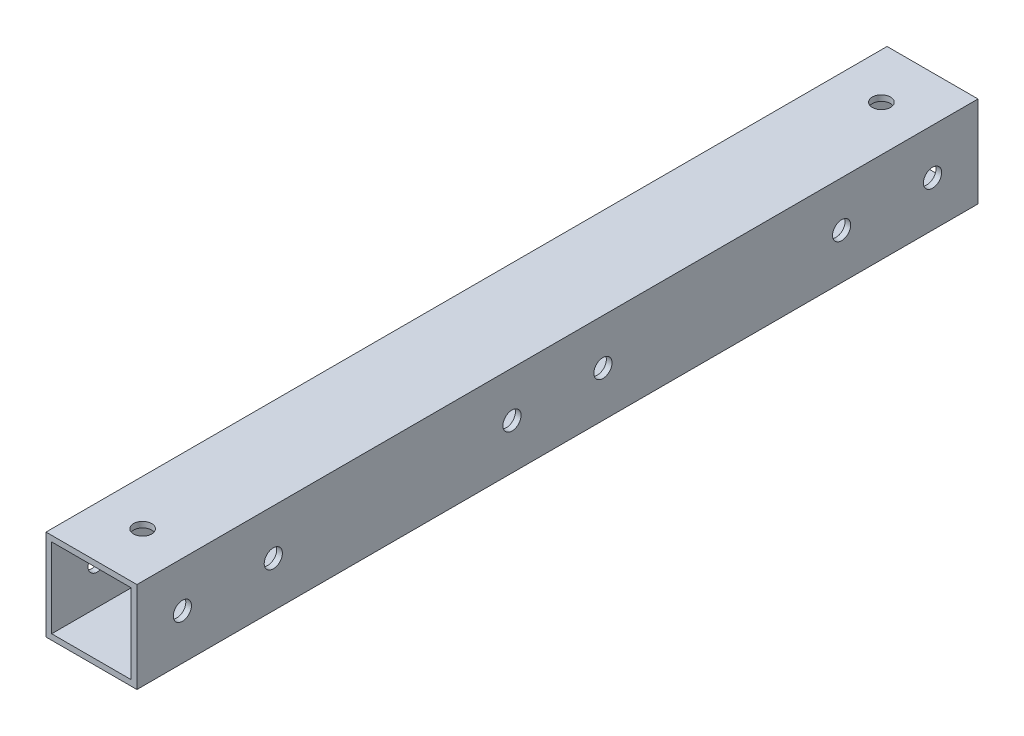
ISO-10303-21;
HEADER;
FILE_DESCRIPTION(('STEP AP214'),'2;1');
FILE_NAME('part.step','',(''),(''),'','','');
FILE_SCHEMA(('AUTOMOTIVE_DESIGN { 1 0 10303 214 1 1 1 1 }'));
ENDSEC;
DATA;
#1=APPLICATION_CONTEXT('core data for automotive mechanical design processes');
#2=APPLICATION_PROTOCOL_DEFINITION('international standard','automotive_design',2000,#1);
#3=PRODUCT_CONTEXT('',#1,'mechanical');
#4=PRODUCT('Part','Part','',(#3));
#5=PRODUCT_RELATED_PRODUCT_CATEGORY('part','',(#4));
#6=PRODUCT_DEFINITION_FORMATION('','',#4);
#7=PRODUCT_DEFINITION_CONTEXT('part definition',#1,'design');
#8=PRODUCT_DEFINITION('design','',#6,#7);
#9=PRODUCT_DEFINITION_SHAPE('','',#8);
#10=(LENGTH_UNIT() NAMED_UNIT(*) SI_UNIT(.MILLI.,.METRE.));
#11=(NAMED_UNIT(*) PLANE_ANGLE_UNIT() SI_UNIT($,.RADIAN.));
#12=(NAMED_UNIT(*) SI_UNIT($,.STERADIAN.) SOLID_ANGLE_UNIT());
#13=UNCERTAINTY_MEASURE_WITH_UNIT(LENGTH_MEASURE(1.E-05),#10,'distance_accuracy_value','');
#14=(GEOMETRIC_REPRESENTATION_CONTEXT(3) GLOBAL_UNCERTAINTY_ASSIGNED_CONTEXT((#13)) GLOBAL_UNIT_ASSIGNED_CONTEXT((#10,
#11,#12)) REPRESENTATION_CONTEXT('',''));
#15=CARTESIAN_POINT('',(0.,0.,0.));
#16=DIRECTION('',(0.,0.,1.));
#17=DIRECTION('',(1.,0.,0.));
#18=AXIS2_PLACEMENT_3D('',#15,#16,#17);
#19=CARTESIAN_POINT('',(0.,0.,234.95));
#20=DIRECTION('',(0.,0.,-1.));
#21=DIRECTION('',(-1.,0.,0.));
#22=AXIS2_PLACEMENT_3D('',#19,#20,#21);
#23=PLANE('',#22);
#24=DIRECTION('',(0.,-1.,0.));
#25=VECTOR('',#24,1.);
#26=CARTESIAN_POINT('',(0.,0.,234.95));
#27=LINE('',#26,#25);
#28=CARTESIAN_POINT('',(0.,25.4,234.95));
#29=VERTEX_POINT('',#28);
#30=CARTESIAN_POINT('',(0.,0.,234.95));
#31=VERTEX_POINT('',#30);
#32=EDGE_CURVE('E157',#29,#31,#27,.T.);
#33=ORIENTED_EDGE('',*,*,#32,.T.);
#34=DIRECTION('',(1.,0.,0.));
#35=VECTOR('',#34,1.);
#36=CARTESIAN_POINT('',(0.,0.,234.95));
#37=LINE('',#36,#35);
#38=CARTESIAN_POINT('',(25.4,0.,234.95));
#39=VERTEX_POINT('',#38);
#40=EDGE_CURVE('E161',#31,#39,#37,.T.);
#41=ORIENTED_EDGE('',*,*,#40,.T.);
#42=DIRECTION('',(0.,1.,0.));
#43=VECTOR('',#42,1.);
#44=CARTESIAN_POINT('',(25.4,0.,234.95));
#45=LINE('',#44,#43);
#46=CARTESIAN_POINT('',(25.4,25.4,234.95));
#47=VERTEX_POINT('',#46);
#48=EDGE_CURVE('E165',#39,#47,#45,.T.);
#49=ORIENTED_EDGE('',*,*,#48,.T.);
#50=DIRECTION('',(-1.,0.,0.));
#51=VECTOR('',#50,1.);
#52=CARTESIAN_POINT('',(0.,25.4,234.95));
#53=LINE('',#52,#51);
#54=EDGE_CURVE('E168',#47,#29,#53,.T.);
#55=ORIENTED_EDGE('',*,*,#54,.T.);
#56=EDGE_LOOP('',(#33,#41,#49,#55));
#57=FACE_BOUND('',#56,.T.);
#58=DIRECTION('',(0.,-1.,0.));
#59=VECTOR('',#58,1.);
#60=CARTESIAN_POINT('',(1.5875,1.5875,234.95));
#61=LINE('',#60,#59);
#62=CARTESIAN_POINT('',(1.5875,23.8125,234.95));
#63=VERTEX_POINT('',#62);
#64=CARTESIAN_POINT('',(1.5875,1.5875,234.95));
#65=VERTEX_POINT('',#64);
#66=EDGE_CURVE('E107',#63,#65,#61,.T.);
#67=ORIENTED_EDGE('',*,*,#66,.F.);
#68=DIRECTION('',(-1.,0.,0.));
#69=VECTOR('',#68,1.);
#70=CARTESIAN_POINT('',(1.5875,23.8125,234.95));
#71=LINE('',#70,#69);
#72=CARTESIAN_POINT('',(23.8125,23.8125,234.95));
#73=VERTEX_POINT('',#72);
#74=EDGE_CURVE('E133',#73,#63,#71,.T.);
#75=ORIENTED_EDGE('',*,*,#74,.F.);
#76=DIRECTION('',(0.,1.,0.));
#77=VECTOR('',#76,1.);
#78=CARTESIAN_POINT('',(23.8125,1.5875,234.95));
#79=LINE('',#78,#77);
#80=CARTESIAN_POINT('',(23.8125,1.5875,234.95));
#81=VERTEX_POINT('',#80);
#82=EDGE_CURVE('E129',#81,#73,#79,.T.);
#83=ORIENTED_EDGE('',*,*,#82,.F.);
#84=DIRECTION('',(1.,0.,0.));
#85=VECTOR('',#84,1.);
#86=CARTESIAN_POINT('',(1.5875,1.5875,234.95));
#87=LINE('',#86,#85);
#88=EDGE_CURVE('E116',#65,#81,#87,.T.);
#89=ORIENTED_EDGE('',*,*,#88,.F.);
#90=EDGE_LOOP('',(#67,#75,#83,#89));
#91=FACE_BOUND('',#90,.T.);
#92=ADVANCED_FACE('F39',(#57,#91),#23,.F.);
#93=CARTESIAN_POINT('',(0.,0.,0.));
#94=DIRECTION('',(0.,0.,-1.));
#95=DIRECTION('',(-1.,0.,0.));
#96=AXIS2_PLACEMENT_3D('',#93,#94,#95);
#97=PLANE('',#96);
#98=DIRECTION('',(0.,-1.,0.));
#99=VECTOR('',#98,1.);
#100=CARTESIAN_POINT('',(0.,0.,0.));
#101=LINE('',#100,#99);
#102=CARTESIAN_POINT('',(0.,25.4,0.));
#103=VERTEX_POINT('',#102);
#104=CARTESIAN_POINT('',(0.,0.,0.));
#105=VERTEX_POINT('',#104);
#106=EDGE_CURVE('E125',#103,#105,#101,.T.);
#107=ORIENTED_EDGE('',*,*,#106,.F.);
#108=DIRECTION('',(-1.,0.,0.));
#109=VECTOR('',#108,1.);
#110=CARTESIAN_POINT('',(0.,25.4,0.));
#111=LINE('',#110,#109);
#112=CARTESIAN_POINT('',(25.4,25.4,0.));
#113=VERTEX_POINT('',#112);
#114=EDGE_CURVE('E162',#113,#103,#111,.T.);
#115=ORIENTED_EDGE('',*,*,#114,.F.);
#116=DIRECTION('',(0.,1.,0.));
#117=VECTOR('',#116,1.);
#118=CARTESIAN_POINT('',(25.4,0.,0.));
#119=LINE('',#118,#117);
#120=CARTESIAN_POINT('',(25.4,0.,0.));
#121=VERTEX_POINT('',#120);
#122=EDGE_CURVE('E178',#121,#113,#119,.T.);
#123=ORIENTED_EDGE('',*,*,#122,.F.);
#124=DIRECTION('',(1.,0.,0.));
#125=VECTOR('',#124,1.);
#126=CARTESIAN_POINT('',(0.,0.,0.));
#127=LINE('',#126,#125);
#128=EDGE_CURVE('E175',#105,#121,#127,.T.);
#129=ORIENTED_EDGE('',*,*,#128,.F.);
#130=EDGE_LOOP('',(#107,#115,#123,#129));
#131=FACE_BOUND('',#130,.T.);
#132=DIRECTION('',(-1.,0.,0.));
#133=VECTOR('',#132,1.);
#134=CARTESIAN_POINT('',(1.5875,23.8125,0.));
#135=LINE('',#134,#133);
#136=CARTESIAN_POINT('',(23.8125,23.8125,0.));
#137=VERTEX_POINT('',#136);
#138=CARTESIAN_POINT('',(1.5875,23.8125,0.));
#139=VERTEX_POINT('',#138);
#140=EDGE_CURVE('E117',#137,#139,#135,.T.);
#141=ORIENTED_EDGE('',*,*,#140,.T.);
#142=DIRECTION('',(0.,-1.,0.));
#143=VECTOR('',#142,1.);
#144=CARTESIAN_POINT('',(1.5875,1.5875,0.));
#145=LINE('',#144,#143);
#146=CARTESIAN_POINT('',(1.5875,1.5875,0.));
#147=VERTEX_POINT('',#146);
#148=EDGE_CURVE('E65',#139,#147,#145,.T.);
#149=ORIENTED_EDGE('',*,*,#148,.T.);
#150=DIRECTION('',(1.,0.,0.));
#151=VECTOR('',#150,1.);
#152=CARTESIAN_POINT('',(1.5875,1.5875,0.));
#153=LINE('',#152,#151);
#154=CARTESIAN_POINT('',(23.8125,1.5875,0.));
#155=VERTEX_POINT('',#154);
#156=EDGE_CURVE('E123',#147,#155,#153,.T.);
#157=ORIENTED_EDGE('',*,*,#156,.T.);
#158=DIRECTION('',(0.,1.,0.));
#159=VECTOR('',#158,1.);
#160=CARTESIAN_POINT('',(23.8125,1.5875,0.));
#161=LINE('',#160,#159);
#162=EDGE_CURVE('E144',#155,#137,#161,.T.);
#163=ORIENTED_EDGE('',*,*,#162,.T.);
#164=EDGE_LOOP('',(#141,#149,#157,#163));
#165=FACE_BOUND('',#164,.T.);
#166=ADVANCED_FACE('F256',(#131,#165),#97,.T.);
#167=CARTESIAN_POINT('',(0.,0.,234.95));
#168=DIRECTION('',(1.,0.,0.));
#169=DIRECTION('',(0.,0.,-1.));
#170=AXIS2_PLACEMENT_3D('',#167,#168,#169);
#171=PLANE('',#170);
#172=CARTESIAN_POINT('',(0.,12.7,222.25));
#173=DIRECTION('',(1.,0.,0.));
#174=DIRECTION('',(0.,0.,-1.));
#175=AXIS2_PLACEMENT_3D('',#172,#173,#174);
#176=CIRCLE('',#175,2.53999999999998);
#177=CARTESIAN_POINT('',(0.,12.7,219.71));
#178=VERTEX_POINT('',#177);
#179=EDGE_CURVE('E198',#178,#178,#176,.T.);
#180=ORIENTED_EDGE('',*,*,#179,.T.);
#181=EDGE_LOOP('',(#180));
#182=FACE_BOUND('',#181,.T.);
#183=CARTESIAN_POINT('',(0.,12.7,38.1));
#184=DIRECTION('',(1.,0.,0.));
#185=DIRECTION('',(0.,0.,1.));
#186=AXIS2_PLACEMENT_3D('',#183,#184,#185);
#187=CIRCLE('',#186,2.53999999999998);
#188=CARTESIAN_POINT('',(0.,12.7,40.6399999999999));
#189=VERTEX_POINT('',#188);
#190=EDGE_CURVE('E316',#189,#189,#187,.T.);
#191=ORIENTED_EDGE('',*,*,#190,.T.);
#192=EDGE_LOOP('',(#191));
#193=FACE_BOUND('',#192,.T.);
#194=CARTESIAN_POINT('',(0.,12.7,130.175));
#195=DIRECTION('',(1.,0.,0.));
#196=DIRECTION('',(0.,0.,1.));
#197=AXIS2_PLACEMENT_3D('',#194,#195,#196);
#198=CIRCLE('',#197,2.54000000000001);
#199=CARTESIAN_POINT('',(0.,12.7,132.715));
#200=VERTEX_POINT('',#199);
#201=EDGE_CURVE('E320',#200,#200,#198,.T.);
#202=ORIENTED_EDGE('',*,*,#201,.T.);
#203=EDGE_LOOP('',(#202));
#204=FACE_BOUND('',#203,.T.);
#205=CARTESIAN_POINT('',(0.,12.7,104.775));
#206=DIRECTION('',(1.,0.,0.));
#207=DIRECTION('',(0.,0.,-1.));
#208=AXIS2_PLACEMENT_3D('',#205,#206,#207);
#209=CIRCLE('',#208,2.54);
#210=CARTESIAN_POINT('',(0.,12.7,102.235));
#211=VERTEX_POINT('',#210);
#212=EDGE_CURVE('E324',#211,#211,#209,.T.);
#213=ORIENTED_EDGE('',*,*,#212,.T.);
#214=EDGE_LOOP('',(#213));
#215=FACE_BOUND('',#214,.T.);
#216=CARTESIAN_POINT('',(0.,12.7,196.85));
#217=DIRECTION('',(1.,0.,0.));
#218=DIRECTION('',(0.,0.,-1.));
#219=AXIS2_PLACEMENT_3D('',#216,#217,#218);
#220=CIRCLE('',#219,2.53999999999998);
#221=CARTESIAN_POINT('',(0.,12.7,194.31));
#222=VERTEX_POINT('',#221);
#223=EDGE_CURVE('E328',#222,#222,#220,.T.);
#224=ORIENTED_EDGE('',*,*,#223,.T.);
#225=EDGE_LOOP('',(#224));
#226=FACE_BOUND('',#225,.T.);
#227=CARTESIAN_POINT('',(0.,12.7,12.7));
#228=DIRECTION('',(1.,0.,0.));
#229=DIRECTION('',(0.,0.,1.));
#230=AXIS2_PLACEMENT_3D('',#227,#228,#229);
#231=CIRCLE('',#230,2.53999999999998);
#232=CARTESIAN_POINT('',(0.,12.7,15.24));
#233=VERTEX_POINT('',#232);
#234=EDGE_CURVE('E331',#233,#233,#231,.T.);
#235=ORIENTED_EDGE('',*,*,#234,.T.);
#236=EDGE_LOOP('',(#235));
#237=FACE_BOUND('',#236,.T.);
#238=ORIENTED_EDGE('',*,*,#106,.T.);
#239=DIRECTION('',(0.,0.,-1.));
#240=VECTOR('',#239,1.);
#241=CARTESIAN_POINT('',(0.,0.,234.95));
#242=LINE('',#241,#240);
#243=EDGE_CURVE('E11',#31,#105,#242,.T.);
#244=ORIENTED_EDGE('',*,*,#243,.F.);
#245=ORIENTED_EDGE('',*,*,#32,.F.);
#246=DIRECTION('',(0.,0.,-1.));
#247=VECTOR('',#246,1.);
#248=CARTESIAN_POINT('',(0.,25.4,234.95));
#249=LINE('',#248,#247);
#250=EDGE_CURVE('E171',#29,#103,#249,.T.);
#251=ORIENTED_EDGE('',*,*,#250,.T.);
#252=EDGE_LOOP('',(#238,#244,#245,#251));
#253=FACE_BOUND('',#252,.T.);
#254=ADVANCED_FACE('F41',(#182,#193,#204,#215,#226,#237,#253),#171,.F.);
#255=CARTESIAN_POINT('',(0.,0.,234.95));
#256=DIRECTION('',(0.,1.,0.));
#257=DIRECTION('',(0.,0.,1.));
#258=AXIS2_PLACEMENT_3D('',#255,#256,#257);
#259=PLANE('',#258);
#260=ORIENTED_EDGE('',*,*,#128,.T.);
#261=DIRECTION('',(0.,0.,-1.));
#262=VECTOR('',#261,1.);
#263=CARTESIAN_POINT('',(25.4,0.,234.95));
#264=LINE('',#263,#262);
#265=EDGE_CURVE('E49',#39,#121,#264,.T.);
#266=ORIENTED_EDGE('',*,*,#265,.F.);
#267=ORIENTED_EDGE('',*,*,#40,.F.);
#268=ORIENTED_EDGE('',*,*,#243,.T.);
#269=EDGE_LOOP('',(#260,#266,#267,#268));
#270=FACE_BOUND('',#269,.T.);
#271=ADVANCED_FACE('F287',(#270),#259,.F.);
#272=CARTESIAN_POINT('',(25.4,0.,234.95));
#273=DIRECTION('',(-1.,0.,0.));
#274=DIRECTION('',(0.,0.,1.));
#275=AXIS2_PLACEMENT_3D('',#272,#273,#274);
#276=PLANE('',#275);
#277=CARTESIAN_POINT('',(25.4,12.7,222.25));
#278=DIRECTION('',(1.,0.,0.));
#279=DIRECTION('',(0.,0.,-1.));
#280=AXIS2_PLACEMENT_3D('',#277,#278,#279);
#281=CIRCLE('',#280,2.53999999999998);
#282=CARTESIAN_POINT('',(25.4,12.7,219.71));
#283=VERTEX_POINT('',#282);
#284=EDGE_CURVE('E416',#283,#283,#281,.T.);
#285=ORIENTED_EDGE('',*,*,#284,.F.);
#286=EDGE_LOOP('',(#285));
#287=FACE_BOUND('',#286,.T.);
#288=CARTESIAN_POINT('',(25.4,12.7,38.1));
#289=DIRECTION('',(1.,0.,0.));
#290=DIRECTION('',(0.,0.,1.));
#291=AXIS2_PLACEMENT_3D('',#288,#289,#290);
#292=CIRCLE('',#291,2.53999999999998);
#293=CARTESIAN_POINT('',(25.4,12.7,40.6399999999999));
#294=VERTEX_POINT('',#293);
#295=EDGE_CURVE('E334',#294,#294,#292,.T.);
#296=ORIENTED_EDGE('',*,*,#295,.F.);
#297=EDGE_LOOP('',(#296));
#298=FACE_BOUND('',#297,.T.);
#299=CARTESIAN_POINT('',(25.4,12.7,130.175));
#300=DIRECTION('',(1.,0.,0.));
#301=DIRECTION('',(0.,0.,1.));
#302=AXIS2_PLACEMENT_3D('',#299,#300,#301);
#303=CIRCLE('',#302,2.54000000000001);
#304=CARTESIAN_POINT('',(25.4,12.7,132.715));
#305=VERTEX_POINT('',#304);
#306=EDGE_CURVE('E422',#305,#305,#303,.T.);
#307=ORIENTED_EDGE('',*,*,#306,.F.);
#308=EDGE_LOOP('',(#307));
#309=FACE_BOUND('',#308,.T.);
#310=CARTESIAN_POINT('',(25.4,12.7,104.775));
#311=DIRECTION('',(1.,0.,0.));
#312=DIRECTION('',(0.,0.,-1.));
#313=AXIS2_PLACEMENT_3D('',#310,#311,#312);
#314=CIRCLE('',#313,2.54);
#315=CARTESIAN_POINT('',(25.4,12.7,102.235));
#316=VERTEX_POINT('',#315);
#317=EDGE_CURVE('E345',#316,#316,#314,.T.);
#318=ORIENTED_EDGE('',*,*,#317,.F.);
#319=EDGE_LOOP('',(#318));
#320=FACE_BOUND('',#319,.T.);
#321=CARTESIAN_POINT('',(25.4,12.7,196.85));
#322=DIRECTION('',(1.,0.,0.));
#323=DIRECTION('',(0.,0.,-1.));
#324=AXIS2_PLACEMENT_3D('',#321,#322,#323);
#325=CIRCLE('',#324,2.53999999999998);
#326=CARTESIAN_POINT('',(25.4,12.7,194.31));
#327=VERTEX_POINT('',#326);
#328=EDGE_CURVE('E430',#327,#327,#325,.T.);
#329=ORIENTED_EDGE('',*,*,#328,.F.);
#330=EDGE_LOOP('',(#329));
#331=FACE_BOUND('',#330,.T.);
#332=CARTESIAN_POINT('',(25.4,12.7,12.7));
#333=DIRECTION('',(1.,0.,0.));
#334=DIRECTION('',(0.,0.,1.));
#335=AXIS2_PLACEMENT_3D('',#332,#333,#334);
#336=CIRCLE('',#335,2.53999999999998);
#337=CARTESIAN_POINT('',(25.4,12.7,15.24));
#338=VERTEX_POINT('',#337);
#339=EDGE_CURVE('E335',#338,#338,#336,.T.);
#340=ORIENTED_EDGE('',*,*,#339,.F.);
#341=EDGE_LOOP('',(#340));
#342=FACE_BOUND('',#341,.T.);
#343=ORIENTED_EDGE('',*,*,#122,.T.);
#344=DIRECTION('',(0.,0.,-1.));
#345=VECTOR('',#344,1.);
#346=CARTESIAN_POINT('',(25.4,25.4,234.95));
#347=LINE('',#346,#345);
#348=EDGE_CURVE('E186',#47,#113,#347,.T.);
#349=ORIENTED_EDGE('',*,*,#348,.F.);
#350=ORIENTED_EDGE('',*,*,#48,.F.);
#351=ORIENTED_EDGE('',*,*,#265,.T.);
#352=EDGE_LOOP('',(#343,#349,#350,#351));
#353=FACE_BOUND('',#352,.T.);
#354=ADVANCED_FACE('F284',(#287,#298,#309,#320,#331,#342,#353),#276,.F.);
#355=CARTESIAN_POINT('',(0.,25.4,234.95));
#356=DIRECTION('',(0.,-1.,0.));
#357=DIRECTION('',(0.,0.,-1.));
#358=AXIS2_PLACEMENT_3D('',#355,#356,#357);
#359=PLANE('',#358);
#360=CARTESIAN_POINT('',(12.7,25.4,220.6625));
#361=DIRECTION('',(0.,1.,0.));
#362=DIRECTION('',(0.,0.,1.));
#363=AXIS2_PLACEMENT_3D('',#360,#361,#362);
#364=CIRCLE('',#363,2.54000000000001);
#365=CARTESIAN_POINT('',(12.7,25.4,223.2025));
#366=VERTEX_POINT('',#365);
#367=EDGE_CURVE('E342',#366,#366,#364,.T.);
#368=ORIENTED_EDGE('',*,*,#367,.F.);
#369=EDGE_LOOP('',(#368));
#370=FACE_BOUND('',#369,.T.);
#371=CARTESIAN_POINT('',(12.7,25.4,14.2875));
#372=DIRECTION('',(0.,1.,0.));
#373=DIRECTION('',(0.,0.,-1.));
#374=AXIS2_PLACEMENT_3D('',#371,#372,#373);
#375=CIRCLE('',#374,2.54);
#376=CARTESIAN_POINT('',(12.7,25.4,16.8275));
#377=VERTEX_POINT('',#376);
#378=EDGE_CURVE('E404',#377,#377,#375,.T.);
#379=ORIENTED_EDGE('',*,*,#378,.F.);
#380=EDGE_LOOP('',(#379));
#381=FACE_BOUND('',#380,.T.);
#382=ORIENTED_EDGE('',*,*,#114,.T.);
#383=ORIENTED_EDGE('',*,*,#250,.F.);
#384=ORIENTED_EDGE('',*,*,#54,.F.);
#385=ORIENTED_EDGE('',*,*,#348,.T.);
#386=EDGE_LOOP('',(#382,#383,#384,#385));
#387=FACE_BOUND('',#386,.T.);
#388=ADVANCED_FACE('F281',(#370,#381,#387),#359,.F.);
#389=CARTESIAN_POINT('',(1.5875,1.5875,234.95));
#390=DIRECTION('',(1.,0.,0.));
#391=DIRECTION('',(0.,0.,-1.));
#392=AXIS2_PLACEMENT_3D('',#389,#390,#391);
#393=PLANE('',#392);
#394=CARTESIAN_POINT('',(1.5875,12.7,222.25));
#395=DIRECTION('',(1.,0.,0.));
#396=DIRECTION('',(0.,0.,-1.));
#397=AXIS2_PLACEMENT_3D('',#394,#395,#396);
#398=CIRCLE('',#397,2.53999999999998);
#399=CARTESIAN_POINT('',(1.5875,12.7,219.71));
#400=VERTEX_POINT('',#399);
#401=EDGE_CURVE('E141',#400,#400,#398,.T.);
#402=ORIENTED_EDGE('',*,*,#401,.F.);
#403=EDGE_LOOP('',(#402));
#404=FACE_BOUND('',#403,.T.);
#405=CARTESIAN_POINT('',(1.5875,12.7,38.1));
#406=DIRECTION('',(1.,0.,0.));
#407=DIRECTION('',(0.,0.,-1.));
#408=AXIS2_PLACEMENT_3D('',#405,#406,#407);
#409=CIRCLE('',#408,2.53999999999998);
#410=CARTESIAN_POINT('',(1.5875,12.7,35.56));
#411=VERTEX_POINT('',#410);
#412=EDGE_CURVE('E216',#411,#411,#409,.T.);
#413=ORIENTED_EDGE('',*,*,#412,.F.);
#414=EDGE_LOOP('',(#413));
#415=FACE_BOUND('',#414,.T.);
#416=CARTESIAN_POINT('',(1.5875,12.7,130.175));
#417=DIRECTION('',(1.,0.,0.));
#418=DIRECTION('',(0.,0.,-1.));
#419=AXIS2_PLACEMENT_3D('',#416,#417,#418);
#420=CIRCLE('',#419,2.54000000000001);
#421=CARTESIAN_POINT('',(1.5875,12.7,127.635));
#422=VERTEX_POINT('',#421);
#423=EDGE_CURVE('E212',#422,#422,#420,.T.);
#424=ORIENTED_EDGE('',*,*,#423,.F.);
#425=EDGE_LOOP('',(#424));
#426=FACE_BOUND('',#425,.T.);
#427=CARTESIAN_POINT('',(1.5875,12.7,104.775));
#428=DIRECTION('',(1.,0.,0.));
#429=DIRECTION('',(0.,0.,-1.));
#430=AXIS2_PLACEMENT_3D('',#427,#428,#429);
#431=CIRCLE('',#430,2.54);
#432=CARTESIAN_POINT('',(1.5875,12.7,102.235));
#433=VERTEX_POINT('',#432);
#434=EDGE_CURVE('E208',#433,#433,#431,.T.);
#435=ORIENTED_EDGE('',*,*,#434,.F.);
#436=EDGE_LOOP('',(#435));
#437=FACE_BOUND('',#436,.T.);
#438=CARTESIAN_POINT('',(1.5875,12.7,196.85));
#439=DIRECTION('',(1.,0.,0.));
#440=DIRECTION('',(0.,0.,-1.));
#441=AXIS2_PLACEMENT_3D('',#438,#439,#440);
#442=CIRCLE('',#441,2.53999999999998);
#443=CARTESIAN_POINT('',(1.5875,12.7,194.31));
#444=VERTEX_POINT('',#443);
#445=EDGE_CURVE('E203',#444,#444,#442,.T.);
#446=ORIENTED_EDGE('',*,*,#445,.F.);
#447=EDGE_LOOP('',(#446));
#448=FACE_BOUND('',#447,.T.);
#449=CARTESIAN_POINT('',(1.5875,12.7,12.7));
#450=DIRECTION('',(1.,0.,0.));
#451=DIRECTION('',(0.,0.,-1.));
#452=AXIS2_PLACEMENT_3D('',#449,#450,#451);
#453=CIRCLE('',#452,2.53999999999998);
#454=CARTESIAN_POINT('',(1.5875,12.7,10.16));
#455=VERTEX_POINT('',#454);
#456=EDGE_CURVE('E197',#455,#455,#453,.T.);
#457=ORIENTED_EDGE('',*,*,#456,.F.);
#458=EDGE_LOOP('',(#457));
#459=FACE_BOUND('',#458,.T.);
#460=ORIENTED_EDGE('',*,*,#148,.F.);
#461=DIRECTION('',(0.,0.,-1.));
#462=VECTOR('',#461,1.);
#463=CARTESIAN_POINT('',(1.5875,23.8125,234.95));
#464=LINE('',#463,#462);
#465=EDGE_CURVE('E111',#63,#139,#464,.T.);
#466=ORIENTED_EDGE('',*,*,#465,.F.);
#467=ORIENTED_EDGE('',*,*,#66,.T.);
#468=DIRECTION('',(0.,0.,-1.));
#469=VECTOR('',#468,1.);
#470=CARTESIAN_POINT('',(1.5875,1.5875,234.95));
#471=LINE('',#470,#469);
#472=EDGE_CURVE('E110',#65,#147,#471,.T.);
#473=ORIENTED_EDGE('',*,*,#472,.T.);
#474=EDGE_LOOP('',(#460,#466,#467,#473));
#475=FACE_BOUND('',#474,.T.);
#476=ADVANCED_FACE('F109',(#404,#415,#426,#437,#448,#459,#475),#393,.T.);
#477=CARTESIAN_POINT('',(1.5875,1.5875,234.95));
#478=DIRECTION('',(0.,1.,0.));
#479=DIRECTION('',(0.,0.,1.));
#480=AXIS2_PLACEMENT_3D('',#477,#478,#479);
#481=PLANE('',#480);
#482=ORIENTED_EDGE('',*,*,#156,.F.);
#483=ORIENTED_EDGE('',*,*,#472,.F.);
#484=ORIENTED_EDGE('',*,*,#88,.T.);
#485=DIRECTION('',(0.,0.,-1.));
#486=VECTOR('',#485,1.);
#487=CARTESIAN_POINT('',(23.8125,1.5875,234.95));
#488=LINE('',#487,#486);
#489=EDGE_CURVE('E126',#81,#155,#488,.T.);
#490=ORIENTED_EDGE('',*,*,#489,.T.);
#491=EDGE_LOOP('',(#482,#483,#484,#490));
#492=FACE_BOUND('',#491,.T.);
#493=ADVANCED_FACE('F120',(#492),#481,.T.);
#494=CARTESIAN_POINT('',(23.8125,1.5875,234.95));
#495=DIRECTION('',(-1.,0.,0.));
#496=DIRECTION('',(0.,0.,1.));
#497=AXIS2_PLACEMENT_3D('',#494,#495,#496);
#498=PLANE('',#497);
#499=CARTESIAN_POINT('',(23.8125,12.7,222.25));
#500=DIRECTION('',(-1.,0.,0.));
#501=DIRECTION('',(0.,0.,1.));
#502=AXIS2_PLACEMENT_3D('',#499,#500,#501);
#503=CIRCLE('',#502,2.53999999999998);
#504=CARTESIAN_POINT('',(23.8125,12.7,224.79));
#505=VERTEX_POINT('',#504);
#506=EDGE_CURVE('E43',#505,#505,#503,.T.);
#507=ORIENTED_EDGE('',*,*,#506,.F.);
#508=EDGE_LOOP('',(#507));
#509=FACE_BOUND('',#508,.T.);
#510=CARTESIAN_POINT('',(23.8125,12.7,38.1));
#511=DIRECTION('',(-1.,0.,0.));
#512=DIRECTION('',(0.,0.,1.));
#513=AXIS2_PLACEMENT_3D('',#510,#511,#512);
#514=CIRCLE('',#513,2.53999999999998);
#515=CARTESIAN_POINT('',(23.8125,12.7,40.6399999999999));
#516=VERTEX_POINT('',#515);
#517=EDGE_CURVE('E213',#516,#516,#514,.T.);
#518=ORIENTED_EDGE('',*,*,#517,.F.);
#519=EDGE_LOOP('',(#518));
#520=FACE_BOUND('',#519,.T.);
#521=CARTESIAN_POINT('',(23.8125,12.7,130.175));
#522=DIRECTION('',(-1.,0.,0.));
#523=DIRECTION('',(0.,0.,1.));
#524=AXIS2_PLACEMENT_3D('',#521,#522,#523);
#525=CIRCLE('',#524,2.54000000000001);
#526=CARTESIAN_POINT('',(23.8125,12.7,132.715));
#527=VERTEX_POINT('',#526);
#528=EDGE_CURVE('E209',#527,#527,#525,.T.);
#529=ORIENTED_EDGE('',*,*,#528,.F.);
#530=EDGE_LOOP('',(#529));
#531=FACE_BOUND('',#530,.T.);
#532=CARTESIAN_POINT('',(23.8125,12.7,104.775));
#533=DIRECTION('',(-1.,0.,0.));
#534=DIRECTION('',(0.,0.,1.));
#535=AXIS2_PLACEMENT_3D('',#532,#533,#534);
#536=CIRCLE('',#535,2.54);
#537=CARTESIAN_POINT('',(23.8125,12.7,107.315));
#538=VERTEX_POINT('',#537);
#539=EDGE_CURVE('E204',#538,#538,#536,.T.);
#540=ORIENTED_EDGE('',*,*,#539,.F.);
#541=EDGE_LOOP('',(#540));
#542=FACE_BOUND('',#541,.T.);
#543=CARTESIAN_POINT('',(23.8125,12.7,196.85));
#544=DIRECTION('',(-1.,0.,0.));
#545=DIRECTION('',(0.,0.,1.));
#546=AXIS2_PLACEMENT_3D('',#543,#544,#545);
#547=CIRCLE('',#546,2.53999999999998);
#548=CARTESIAN_POINT('',(23.8125,12.7,199.39));
#549=VERTEX_POINT('',#548);
#550=EDGE_CURVE('E199',#549,#549,#547,.T.);
#551=ORIENTED_EDGE('',*,*,#550,.F.);
#552=EDGE_LOOP('',(#551));
#553=FACE_BOUND('',#552,.T.);
#554=CARTESIAN_POINT('',(23.8125,12.7,12.7));
#555=DIRECTION('',(-1.,0.,0.));
#556=DIRECTION('',(0.,0.,1.));
#557=AXIS2_PLACEMENT_3D('',#554,#555,#556);
#558=CIRCLE('',#557,2.53999999999998);
#559=CARTESIAN_POINT('',(23.8125,12.7,15.24));
#560=VERTEX_POINT('',#559);
#561=EDGE_CURVE('E193',#560,#560,#558,.T.);
#562=ORIENTED_EDGE('',*,*,#561,.F.);
#563=EDGE_LOOP('',(#562));
#564=FACE_BOUND('',#563,.T.);
#565=ORIENTED_EDGE('',*,*,#162,.F.);
#566=ORIENTED_EDGE('',*,*,#489,.F.);
#567=ORIENTED_EDGE('',*,*,#82,.T.);
#568=DIRECTION('',(0.,0.,-1.));
#569=VECTOR('',#568,1.);
#570=CARTESIAN_POINT('',(23.8125,23.8125,234.95));
#571=LINE('',#570,#569);
#572=EDGE_CURVE('E57',#73,#137,#571,.T.);
#573=ORIENTED_EDGE('',*,*,#572,.T.);
#574=EDGE_LOOP('',(#565,#566,#567,#573));
#575=FACE_BOUND('',#574,.T.);
#576=ADVANCED_FACE('F240',(#509,#520,#531,#542,#553,#564,#575),#498,.T.);
#577=CARTESIAN_POINT('',(1.5875,23.8125,234.95));
#578=DIRECTION('',(0.,-1.,0.));
#579=DIRECTION('',(0.,0.,-1.));
#580=AXIS2_PLACEMENT_3D('',#577,#578,#579);
#581=PLANE('',#580);
#582=CARTESIAN_POINT('',(12.7,23.8125,220.6625));
#583=DIRECTION('',(0.,-1.,0.));
#584=DIRECTION('',(0.,0.,-1.));
#585=AXIS2_PLACEMENT_3D('',#582,#583,#584);
#586=CIRCLE('',#585,2.54000000000001);
#587=CARTESIAN_POINT('',(12.7,23.8125,223.2025));
#588=VERTEX_POINT('',#587);
#589=EDGE_CURVE('E398',#588,#588,#586,.F.);
#590=ORIENTED_EDGE('',*,*,#589,.T.);
#591=EDGE_LOOP('',(#590));
#592=FACE_BOUND('',#591,.T.);
#593=CARTESIAN_POINT('',(12.7,23.8125,14.2875));
#594=DIRECTION('',(0.,-1.,0.));
#595=DIRECTION('',(0.,0.,-1.));
#596=AXIS2_PLACEMENT_3D('',#593,#594,#595);
#597=CIRCLE('',#596,2.54);
#598=CARTESIAN_POINT('',(12.7,23.8125,16.8275));
#599=VERTEX_POINT('',#598);
#600=EDGE_CURVE('E410',#599,#599,#597,.F.);
#601=ORIENTED_EDGE('',*,*,#600,.T.);
#602=EDGE_LOOP('',(#601));
#603=FACE_BOUND('',#602,.T.);
#604=ORIENTED_EDGE('',*,*,#140,.F.);
#605=ORIENTED_EDGE('',*,*,#572,.F.);
#606=ORIENTED_EDGE('',*,*,#74,.T.);
#607=ORIENTED_EDGE('',*,*,#465,.T.);
#608=EDGE_LOOP('',(#604,#605,#606,#607));
#609=FACE_BOUND('',#608,.T.);
#610=ADVANCED_FACE('F243',(#592,#603,#609),#581,.T.);
#611=CARTESIAN_POINT('',(0.,12.7,12.7));
#612=DIRECTION('',(1.,0.,0.));
#613=DIRECTION('',(0.,0.,-1.));
#614=AXIS2_PLACEMENT_3D('',#611,#612,#613);
#615=CYLINDRICAL_SURFACE('',#614,2.53999999999998);
#616=ORIENTED_EDGE('',*,*,#561,.T.);
#617=EDGE_LOOP('',(#616));
#618=FACE_BOUND('',#617,.T.);
#619=ORIENTED_EDGE('',*,*,#339,.T.);
#620=EDGE_LOOP('',(#619));
#621=FACE_BOUND('',#620,.T.);
#622=ADVANCED_FACE('F258',(#618,#621),#615,.F.);
#623=CARTESIAN_POINT('',(0.,12.7,196.85));
#624=DIRECTION('',(1.,0.,0.));
#625=DIRECTION('',(0.,0.,-1.));
#626=AXIS2_PLACEMENT_3D('',#623,#624,#625);
#627=CYLINDRICAL_SURFACE('',#626,2.53999999999998);
#628=ORIENTED_EDGE('',*,*,#550,.T.);
#629=EDGE_LOOP('',(#628));
#630=FACE_BOUND('',#629,.T.);
#631=ORIENTED_EDGE('',*,*,#328,.T.);
#632=EDGE_LOOP('',(#631));
#633=FACE_BOUND('',#632,.T.);
#634=ADVANCED_FACE('F264',(#630,#633),#627,.F.);
#635=CARTESIAN_POINT('',(0.,12.7,104.775));
#636=DIRECTION('',(1.,0.,0.));
#637=DIRECTION('',(0.,0.,-1.));
#638=AXIS2_PLACEMENT_3D('',#635,#636,#637);
#639=CYLINDRICAL_SURFACE('',#638,2.54);
#640=ORIENTED_EDGE('',*,*,#539,.T.);
#641=EDGE_LOOP('',(#640));
#642=FACE_BOUND('',#641,.T.);
#643=ORIENTED_EDGE('',*,*,#317,.T.);
#644=EDGE_LOOP('',(#643));
#645=FACE_BOUND('',#644,.T.);
#646=ADVANCED_FACE('F373',(#642,#645),#639,.F.);
#647=CARTESIAN_POINT('',(0.,12.7,130.175));
#648=DIRECTION('',(1.,0.,0.));
#649=DIRECTION('',(0.,0.,-1.));
#650=AXIS2_PLACEMENT_3D('',#647,#648,#649);
#651=CYLINDRICAL_SURFACE('',#650,2.54000000000001);
#652=ORIENTED_EDGE('',*,*,#528,.T.);
#653=EDGE_LOOP('',(#652));
#654=FACE_BOUND('',#653,.T.);
#655=ORIENTED_EDGE('',*,*,#306,.T.);
#656=EDGE_LOOP('',(#655));
#657=FACE_BOUND('',#656,.T.);
#658=ADVANCED_FACE('F375',(#654,#657),#651,.F.);
#659=CARTESIAN_POINT('',(0.,12.7,38.1));
#660=DIRECTION('',(1.,0.,0.));
#661=DIRECTION('',(0.,0.,-1.));
#662=AXIS2_PLACEMENT_3D('',#659,#660,#661);
#663=CYLINDRICAL_SURFACE('',#662,2.53999999999998);
#664=ORIENTED_EDGE('',*,*,#517,.T.);
#665=EDGE_LOOP('',(#664));
#666=FACE_BOUND('',#665,.T.);
#667=ORIENTED_EDGE('',*,*,#295,.T.);
#668=EDGE_LOOP('',(#667));
#669=FACE_BOUND('',#668,.T.);
#670=ADVANCED_FACE('F369',(#666,#669),#663,.F.);
#671=CARTESIAN_POINT('',(0.,12.7,222.25));
#672=DIRECTION('',(1.,0.,0.));
#673=DIRECTION('',(0.,0.,-1.));
#674=AXIS2_PLACEMENT_3D('',#671,#672,#673);
#675=CYLINDRICAL_SURFACE('',#674,2.53999999999998);
#676=ORIENTED_EDGE('',*,*,#506,.T.);
#677=EDGE_LOOP('',(#676));
#678=FACE_BOUND('',#677,.T.);
#679=ORIENTED_EDGE('',*,*,#284,.T.);
#680=EDGE_LOOP('',(#679));
#681=FACE_BOUND('',#680,.T.);
#682=ADVANCED_FACE('F237',(#678,#681),#675,.F.);
#683=ORIENTED_EDGE('',*,*,#456,.T.);
#684=EDGE_LOOP('',(#683));
#685=FACE_BOUND('',#684,.T.);
#686=ORIENTED_EDGE('',*,*,#234,.F.);
#687=EDGE_LOOP('',(#686));
#688=FACE_BOUND('',#687,.T.);
#689=ADVANCED_FACE('F267',(#685,#688),#615,.F.);
#690=ORIENTED_EDGE('',*,*,#445,.T.);
#691=EDGE_LOOP('',(#690));
#692=FACE_BOUND('',#691,.T.);
#693=ORIENTED_EDGE('',*,*,#223,.F.);
#694=EDGE_LOOP('',(#693));
#695=FACE_BOUND('',#694,.T.);
#696=ADVANCED_FACE('F354',(#692,#695),#627,.F.);
#697=ORIENTED_EDGE('',*,*,#434,.T.);
#698=EDGE_LOOP('',(#697));
#699=FACE_BOUND('',#698,.T.);
#700=ORIENTED_EDGE('',*,*,#212,.F.);
#701=EDGE_LOOP('',(#700));
#702=FACE_BOUND('',#701,.T.);
#703=ADVANCED_FACE('F367',(#699,#702),#639,.F.);
#704=ORIENTED_EDGE('',*,*,#423,.T.);
#705=EDGE_LOOP('',(#704));
#706=FACE_BOUND('',#705,.T.);
#707=ORIENTED_EDGE('',*,*,#201,.F.);
#708=EDGE_LOOP('',(#707));
#709=FACE_BOUND('',#708,.T.);
#710=ADVANCED_FACE('F385',(#706,#709),#651,.F.);
#711=ORIENTED_EDGE('',*,*,#412,.T.);
#712=EDGE_LOOP('',(#711));
#713=FACE_BOUND('',#712,.T.);
#714=ORIENTED_EDGE('',*,*,#190,.F.);
#715=EDGE_LOOP('',(#714));
#716=FACE_BOUND('',#715,.T.);
#717=ADVANCED_FACE('F382',(#713,#716),#663,.F.);
#718=ORIENTED_EDGE('',*,*,#401,.T.);
#719=EDGE_LOOP('',(#718));
#720=FACE_BOUND('',#719,.T.);
#721=ORIENTED_EDGE('',*,*,#179,.F.);
#722=EDGE_LOOP('',(#721));
#723=FACE_BOUND('',#722,.T.);
#724=ADVANCED_FACE('F371',(#720,#723),#675,.F.);
#725=CARTESIAN_POINT('',(12.7,-0.001000000000001,14.2875));
#726=DIRECTION('',(0.,1.,0.));
#727=DIRECTION('',(0.,0.,1.));
#728=AXIS2_PLACEMENT_3D('',#725,#726,#727);
#729=CYLINDRICAL_SURFACE('',#728,2.54);
#730=CARTESIAN_POINT('',(12.7,23.8125,16.8275));
#731=CARTESIAN_POINT('',(12.7,23.8290364583333,16.8275));
#732=CARTESIAN_POINT('',(12.7,23.8455729166667,16.8275));
#733=CARTESIAN_POINT('',(12.7,23.8786458333333,16.8275));
#734=CARTESIAN_POINT('',(12.7,23.8951822916667,16.8275));
#735=CARTESIAN_POINT('',(12.7,23.9282552083333,16.8275));
#736=CARTESIAN_POINT('',(12.7,23.9447916666667,16.8275));
#737=CARTESIAN_POINT('',(12.7,23.9778645833333,16.8275));
#738=CARTESIAN_POINT('',(12.7,23.9944010416667,16.8275));
#739=CARTESIAN_POINT('',(12.7,24.0274739583333,16.8275));
#740=CARTESIAN_POINT('',(12.7,24.0440104166667,16.8275));
#741=CARTESIAN_POINT('',(12.7,24.0770833333333,16.8275));
#742=CARTESIAN_POINT('',(12.7,24.0936197916667,16.8275));
#743=CARTESIAN_POINT('',(12.7,24.1266927083333,16.8275));
#744=CARTESIAN_POINT('',(12.7,24.1432291666667,16.8275));
#745=CARTESIAN_POINT('',(12.7,24.1763020833333,16.8275));
#746=CARTESIAN_POINT('',(12.7,24.1928385416667,16.8275));
#747=CARTESIAN_POINT('',(12.7,24.2259114583333,16.8275));
#748=CARTESIAN_POINT('',(12.7,24.2424479166667,16.8275));
#749=CARTESIAN_POINT('',(12.7,24.2755208333333,16.8275));
#750=CARTESIAN_POINT('',(12.7,24.2920572916667,16.8275));
#751=CARTESIAN_POINT('',(12.7,24.3251302083333,16.8275));
#752=CARTESIAN_POINT('',(12.7,24.3416666666667,16.8275));
#753=CARTESIAN_POINT('',(12.7,24.3747395833333,16.8275));
#754=CARTESIAN_POINT('',(12.7,24.3912760416667,16.8275));
#755=CARTESIAN_POINT('',(12.7,24.4243489583333,16.8275));
#756=CARTESIAN_POINT('',(12.7,24.4408854166667,16.8275));
#757=CARTESIAN_POINT('',(12.7,24.4739583333333,16.8275));
#758=CARTESIAN_POINT('',(12.7,24.4904947916667,16.8275));
#759=CARTESIAN_POINT('',(12.7,24.5235677083333,16.8275));
#760=CARTESIAN_POINT('',(12.7,24.5401041666667,16.8275));
#761=CARTESIAN_POINT('',(12.7,24.5731770833333,16.8275));
#762=CARTESIAN_POINT('',(12.7,24.5897135416667,16.8275));
#763=CARTESIAN_POINT('',(12.7,24.6227864583333,16.8275));
#764=CARTESIAN_POINT('',(12.7,24.6393229166667,16.8275));
#765=CARTESIAN_POINT('',(12.7,24.6723958333333,16.8275));
#766=CARTESIAN_POINT('',(12.7,24.6889322916667,16.8275));
#767=CARTESIAN_POINT('',(12.7,24.7220052083333,16.8275));
#768=CARTESIAN_POINT('',(12.7,24.7385416666667,16.8275));
#769=CARTESIAN_POINT('',(12.7,24.7716145833333,16.8275));
#770=CARTESIAN_POINT('',(12.7,24.7881510416667,16.8275));
#771=CARTESIAN_POINT('',(12.7,24.8212239583333,16.8275));
#772=CARTESIAN_POINT('',(12.7,24.8377604166667,16.8275));
#773=CARTESIAN_POINT('',(12.7,24.8708333333333,16.8275));
#774=CARTESIAN_POINT('',(12.7,24.8873697916667,16.8275));
#775=CARTESIAN_POINT('',(12.7,24.9204427083333,16.8275));
#776=CARTESIAN_POINT('',(12.7,24.9369791666667,16.8275));
#777=CARTESIAN_POINT('',(12.7,24.9700520833333,16.8275));
#778=CARTESIAN_POINT('',(12.7,24.9865885416667,16.8275));
#779=CARTESIAN_POINT('',(12.7,25.0196614583333,16.8275));
#780=CARTESIAN_POINT('',(12.7,25.0361979166667,16.8275));
#781=CARTESIAN_POINT('',(12.7,25.0692708333333,16.8275));
#782=CARTESIAN_POINT('',(12.7,25.0858072916667,16.8275));
#783=CARTESIAN_POINT('',(12.7,25.1188802083333,16.8275));
#784=CARTESIAN_POINT('',(12.7,25.1354166666667,16.8275));
#785=CARTESIAN_POINT('',(12.7,25.1684895833333,16.8275));
#786=CARTESIAN_POINT('',(12.7,25.1850260416667,16.8275));
#787=CARTESIAN_POINT('',(12.7,25.2180989583333,16.8275));
#788=CARTESIAN_POINT('',(12.7,25.2346354166667,16.8275));
#789=CARTESIAN_POINT('',(12.7,25.2677083333333,16.8275));
#790=CARTESIAN_POINT('',(12.7,25.2842447916667,16.8275));
#791=CARTESIAN_POINT('',(12.7,25.3173177083333,16.8275));
#792=CARTESIAN_POINT('',(12.7,25.3338541666667,16.8275));
#793=CARTESIAN_POINT('',(12.7,25.3669270833333,16.8275));
#794=CARTESIAN_POINT('',(12.7,25.3834635416667,16.8275));
#795=CARTESIAN_POINT('',(12.7,25.4,16.8275));
#796=B_SPLINE_CURVE_WITH_KNOTS('',3,(#730,#731,#732,#733,#734,#735,#736,#737,#738,#739,#740,
#741,#742,#743,#744,#745,#746,#747,#748,#749,#750,#751,#752,#753,#754,#755,#756,#757,#758,#759,
#760,#761,#762,#763,#764,#765,#766,#767,#768,#769,#770,#771,#772,#773,#774,#775,#776,#777,#778,
#779,#780,#781,#782,#783,#784,#785,#786,#787,#788,#789,#790,#791,#792,#793,#794,#795),
.UNSPECIFIED.,.F.,.F.,(4,2,2,2,2,2,2,2,2,2,2,2,2,2,2,2,2,2,2,2,2,2,2,2,2,2,2,2,2,2,2,2,4),(0.,
0.0496093749999989,0.0992187499999977,0.148828125,0.198437499999999,0.248046874999998,
0.29765625,0.347265624999999,0.396874999999998,0.446484374999997,0.496093749999996,
0.545703124999998,0.595312499999997,0.644921874999996,0.694531249999998,0.744140624999997,
0.793749999999996,0.843359374999995,0.892968749999994,0.942578124999996,0.992187499999995,
1.04179687499999,1.09140625,1.14101562499999,1.19062499999999,1.24023437499999,1.28984374999999,
1.33945312499999,1.38906249999999,1.43867187499999,1.48828124999999,1.53789062499999,
1.58749999999999),.UNSPECIFIED.);
#797=EDGE_CURVE('BSEAM387',#599,#377,#796,.T.);
#798=ORIENTED_EDGE('',*,*,#600,.F.);
#799=ORIENTED_EDGE('',*,*,#378,.T.);
#800=ORIENTED_EDGE('',*,*,#797,.T.);
#801=ORIENTED_EDGE('',*,*,#797,.F.);
#802=EDGE_LOOP('',(#798,#800,#799,#801));
#803=FACE_BOUND('',#802,.T.);
#804=ADVANCED_FACE('F387',(#803),#729,.F.);
#805=CARTESIAN_POINT('',(12.7,-0.001000000000001,220.6625));
#806=DIRECTION('',(0.,1.,0.));
#807=DIRECTION('',(0.,0.,1.));
#808=AXIS2_PLACEMENT_3D('',#805,#806,#807);
#809=CYLINDRICAL_SURFACE('',#808,2.54000000000001);
#810=CARTESIAN_POINT('',(12.7,23.8125,223.2025));
#811=CARTESIAN_POINT('',(12.7,23.8290364583333,223.2025));
#812=CARTESIAN_POINT('',(12.7,23.8455729166667,223.2025));
#813=CARTESIAN_POINT('',(12.7,23.8786458333333,223.2025));
#814=CARTESIAN_POINT('',(12.7,23.8951822916667,223.2025));
#815=CARTESIAN_POINT('',(12.7,23.9282552083333,223.2025));
#816=CARTESIAN_POINT('',(12.7,23.9447916666667,223.2025));
#817=CARTESIAN_POINT('',(12.7,23.9778645833333,223.2025));
#818=CARTESIAN_POINT('',(12.7,23.9944010416667,223.2025));
#819=CARTESIAN_POINT('',(12.7,24.0274739583333,223.2025));
#820=CARTESIAN_POINT('',(12.7,24.0440104166667,223.2025));
#821=CARTESIAN_POINT('',(12.7,24.0770833333333,223.2025));
#822=CARTESIAN_POINT('',(12.7,24.0936197916667,223.2025));
#823=CARTESIAN_POINT('',(12.7,24.1266927083333,223.2025));
#824=CARTESIAN_POINT('',(12.7,24.1432291666667,223.2025));
#825=CARTESIAN_POINT('',(12.7,24.1763020833333,223.2025));
#826=CARTESIAN_POINT('',(12.7,24.1928385416667,223.2025));
#827=CARTESIAN_POINT('',(12.7,24.2259114583333,223.2025));
#828=CARTESIAN_POINT('',(12.7,24.2424479166667,223.2025));
#829=CARTESIAN_POINT('',(12.7,24.2755208333333,223.2025));
#830=CARTESIAN_POINT('',(12.7,24.2920572916667,223.2025));
#831=CARTESIAN_POINT('',(12.7,24.3251302083333,223.2025));
#832=CARTESIAN_POINT('',(12.7,24.3416666666667,223.2025));
#833=CARTESIAN_POINT('',(12.7,24.3747395833333,223.2025));
#834=CARTESIAN_POINT('',(12.7,24.3912760416667,223.2025));
#835=CARTESIAN_POINT('',(12.7,24.4243489583333,223.2025));
#836=CARTESIAN_POINT('',(12.7,24.4408854166667,223.2025));
#837=CARTESIAN_POINT('',(12.7,24.4739583333333,223.2025));
#838=CARTESIAN_POINT('',(12.7,24.4904947916667,223.2025));
#839=CARTESIAN_POINT('',(12.7,24.5235677083333,223.2025));
#840=CARTESIAN_POINT('',(12.7,24.5401041666667,223.2025));
#841=CARTESIAN_POINT('',(12.7,24.5731770833333,223.2025));
#842=CARTESIAN_POINT('',(12.7,24.5897135416667,223.2025));
#843=CARTESIAN_POINT('',(12.7,24.6227864583333,223.2025));
#844=CARTESIAN_POINT('',(12.7,24.6393229166667,223.2025));
#845=CARTESIAN_POINT('',(12.7,24.6723958333333,223.2025));
#846=CARTESIAN_POINT('',(12.7,24.6889322916667,223.2025));
#847=CARTESIAN_POINT('',(12.7,24.7220052083333,223.2025));
#848=CARTESIAN_POINT('',(12.7,24.7385416666667,223.2025));
#849=CARTESIAN_POINT('',(12.7,24.7716145833333,223.2025));
#850=CARTESIAN_POINT('',(12.7,24.7881510416667,223.2025));
#851=CARTESIAN_POINT('',(12.7,24.8212239583333,223.2025));
#852=CARTESIAN_POINT('',(12.7,24.8377604166667,223.2025));
#853=CARTESIAN_POINT('',(12.7,24.8708333333333,223.2025));
#854=CARTESIAN_POINT('',(12.7,24.8873697916667,223.2025));
#855=CARTESIAN_POINT('',(12.7,24.9204427083333,223.2025));
#856=CARTESIAN_POINT('',(12.7,24.9369791666667,223.2025));
#857=CARTESIAN_POINT('',(12.7,24.9700520833333,223.2025));
#858=CARTESIAN_POINT('',(12.7,24.9865885416667,223.2025));
#859=CARTESIAN_POINT('',(12.7,25.0196614583333,223.2025));
#860=CARTESIAN_POINT('',(12.7,25.0361979166667,223.2025));
#861=CARTESIAN_POINT('',(12.7,25.0692708333333,223.2025));
#862=CARTESIAN_POINT('',(12.7,25.0858072916667,223.2025));
#863=CARTESIAN_POINT('',(12.7,25.1188802083333,223.2025));
#864=CARTESIAN_POINT('',(12.7,25.1354166666667,223.2025));
#865=CARTESIAN_POINT('',(12.7,25.1684895833333,223.2025));
#866=CARTESIAN_POINT('',(12.7,25.1850260416667,223.2025));
#867=CARTESIAN_POINT('',(12.7,25.2180989583333,223.2025));
#868=CARTESIAN_POINT('',(12.7,25.2346354166667,223.2025));
#869=CARTESIAN_POINT('',(12.7,25.2677083333333,223.2025));
#870=CARTESIAN_POINT('',(12.7,25.2842447916667,223.2025));
#871=CARTESIAN_POINT('',(12.7,25.3173177083333,223.2025));
#872=CARTESIAN_POINT('',(12.7,25.3338541666667,223.2025));
#873=CARTESIAN_POINT('',(12.7,25.3669270833333,223.2025));
#874=CARTESIAN_POINT('',(12.7,25.3834635416667,223.2025));
#875=CARTESIAN_POINT('',(12.7,25.4,223.2025));
#876=B_SPLINE_CURVE_WITH_KNOTS('',3,(#810,#811,#812,#813,#814,#815,#816,#817,#818,#819,#820,
#821,#822,#823,#824,#825,#826,#827,#828,#829,#830,#831,#832,#833,#834,#835,#836,#837,#838,#839,
#840,#841,#842,#843,#844,#845,#846,#847,#848,#849,#850,#851,#852,#853,#854,#855,#856,#857,#858,
#859,#860,#861,#862,#863,#864,#865,#866,#867,#868,#869,#870,#871,#872,#873,#874,#875),
.UNSPECIFIED.,.F.,.F.,(4,2,2,2,2,2,2,2,2,2,2,2,2,2,2,2,2,2,2,2,2,2,2,2,2,2,2,2,2,2,2,2,4),(0.,
0.0496093749999989,0.0992187499999977,0.148828125,0.198437499999999,0.248046874999998,
0.29765625,0.347265624999999,0.396874999999998,0.446484374999997,0.496093749999996,
0.545703124999998,0.595312499999997,0.644921874999996,0.694531249999998,0.744140624999997,
0.793749999999996,0.843359374999995,0.892968749999994,0.942578124999996,0.992187499999995,
1.04179687499999,1.09140625,1.14101562499999,1.19062499999999,1.24023437499999,1.28984374999999,
1.33945312499999,1.38906249999999,1.43867187499999,1.48828124999999,1.53789062499999,
1.58749999999999),.UNSPECIFIED.);
#877=EDGE_CURVE('BSEAM390',#588,#366,#876,.T.);
#878=ORIENTED_EDGE('',*,*,#589,.F.);
#879=ORIENTED_EDGE('',*,*,#367,.T.);
#880=ORIENTED_EDGE('',*,*,#877,.T.);
#881=ORIENTED_EDGE('',*,*,#877,.F.);
#882=EDGE_LOOP('',(#878,#880,#879,#881));
#883=FACE_BOUND('',#882,.T.);
#884=ADVANCED_FACE('F390',(#883),#809,.F.);
#885=CLOSED_SHELL('',(#92,#166,#254,#271,#354,#388,#476,#493,#576,#610,#622,#634,#646,#658,#670,
#682,#689,#696,#703,#710,#717,#724,#804,#884));
#886=MANIFOLD_SOLID_BREP('B2',#885);
#887=ADVANCED_BREP_SHAPE_REPRESENTATION('',(#18,#886),#14);
#888=SHAPE_DEFINITION_REPRESENTATION(#9,#887);
ENDSEC;
END-ISO-10303-21;
